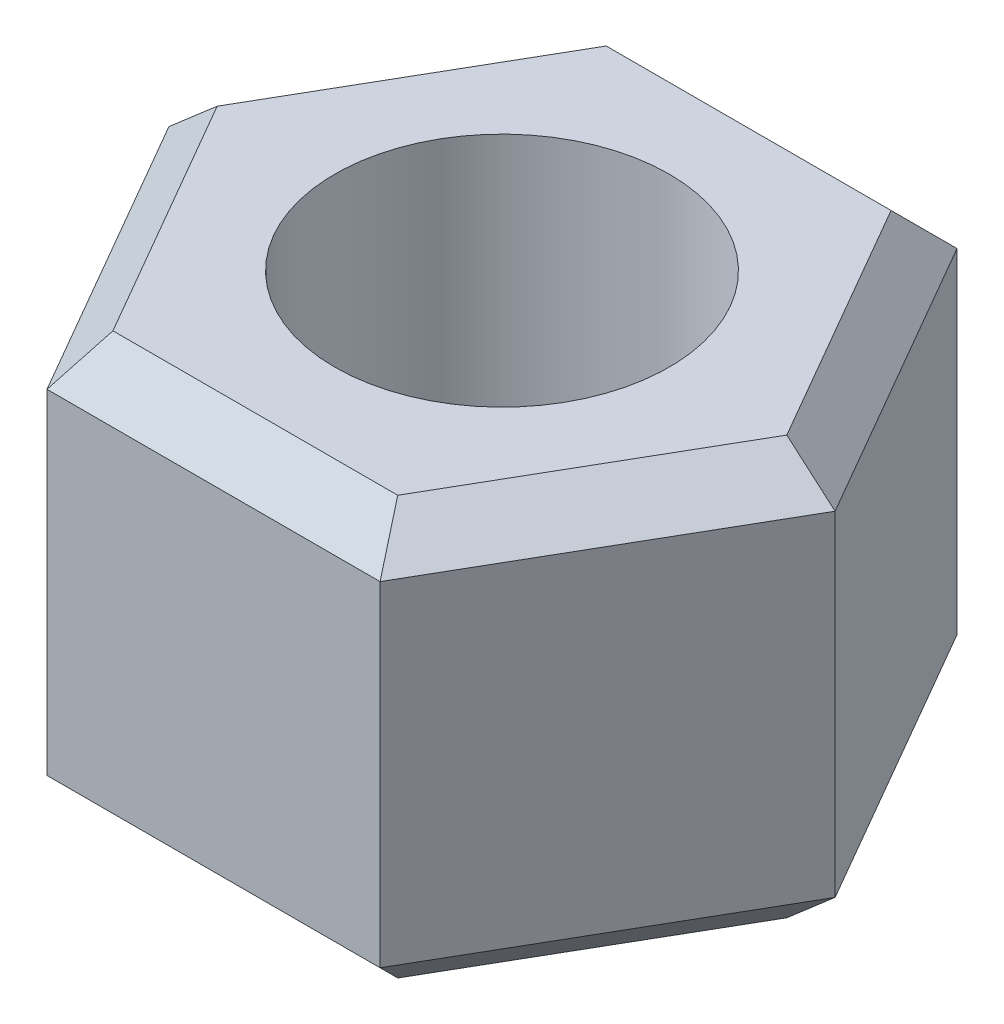
ISO-10303-21;
HEADER;
FILE_DESCRIPTION(('STEP AP214'),'2;1');
FILE_NAME('part.step','',(''),(''),'','','');
FILE_SCHEMA(('AUTOMOTIVE_DESIGN { 1 0 10303 214 1 1 1 1 }'));
ENDSEC;
DATA;
#1=APPLICATION_CONTEXT('core data for automotive mechanical design processes');
#2=APPLICATION_PROTOCOL_DEFINITION('international standard','automotive_design',2000,#1);
#3=PRODUCT_CONTEXT('',#1,'mechanical');
#4=PRODUCT('Part','Part','',(#3));
#5=PRODUCT_RELATED_PRODUCT_CATEGORY('part','',(#4));
#6=PRODUCT_DEFINITION_FORMATION('','',#4);
#7=PRODUCT_DEFINITION_CONTEXT('part definition',#1,'design');
#8=PRODUCT_DEFINITION('design','',#6,#7);
#9=PRODUCT_DEFINITION_SHAPE('','',#8);
#10=(LENGTH_UNIT() NAMED_UNIT(*) SI_UNIT(.MILLI.,.METRE.));
#11=(NAMED_UNIT(*) PLANE_ANGLE_UNIT() SI_UNIT($,.RADIAN.));
#12=(NAMED_UNIT(*) SI_UNIT($,.STERADIAN.) SOLID_ANGLE_UNIT());
#13=UNCERTAINTY_MEASURE_WITH_UNIT(LENGTH_MEASURE(1.E-05),#10,'distance_accuracy_value','');
#14=(GEOMETRIC_REPRESENTATION_CONTEXT(3) GLOBAL_UNCERTAINTY_ASSIGNED_CONTEXT((#13)) GLOBAL_UNIT_ASSIGNED_CONTEXT((#10,
#11,#12)) REPRESENTATION_CONTEXT('',''));
#15=CARTESIAN_POINT('',(0.,0.,0.));
#16=DIRECTION('',(0.,0.,1.));
#17=DIRECTION('',(1.,0.,0.));
#18=AXIS2_PLACEMENT_3D('',#15,#16,#17);
#19=CARTESIAN_POINT('',(0.,5.,0.));
#20=DIRECTION('',(0.,1.,0.));
#21=DIRECTION('',(0.,0.,1.));
#22=AXIS2_PLACEMENT_3D('',#19,#20,#21);
#23=PLANE('',#22);
#24=DIRECTION('',(-0.5,0.,-0.866025403784439));
#25=VECTOR('',#24,1.);
#26=CARTESIAN_POINT('',(1.55884572681199,5.,-3.2));
#27=LINE('',#26,#25);
#28=CARTESIAN_POINT('',(3.40636658821879,5.,0.));
#29=VERTEX_POINT('',#28);
#30=CARTESIAN_POINT('',(1.70318329410939,5.,-2.95));
#31=VERTEX_POINT('',#30);
#32=EDGE_CURVE('E47',#29,#31,#27,.T.);
#33=ORIENTED_EDGE('',*,*,#32,.T.);
#34=DIRECTION('',(-1.,0.,0.));
#35=VECTOR('',#34,1.);
#36=CARTESIAN_POINT('',(-1.99185842870421,5.,-2.95));
#37=LINE('',#36,#35);
#38=CARTESIAN_POINT('',(-1.7031832941094,5.,-2.95));
#39=VERTEX_POINT('',#38);
#40=EDGE_CURVE('E11',#31,#39,#37,.T.);
#41=ORIENTED_EDGE('',*,*,#40,.T.);
#42=DIRECTION('',(-0.5,0.,0.866025403784439));
#43=VECTOR('',#42,1.);
#44=CARTESIAN_POINT('',(-3.5507041555162,5.,0.250000000000001));
#45=LINE('',#44,#43);
#46=CARTESIAN_POINT('',(-3.40636658821879,5.,0.));
#47=VERTEX_POINT('',#46);
#48=EDGE_CURVE('E198',#39,#47,#45,.T.);
#49=ORIENTED_EDGE('',*,*,#48,.T.);
#50=DIRECTION('',(0.5,0.,0.866025403784439));
#51=VECTOR('',#50,1.);
#52=CARTESIAN_POINT('',(-1.55884572681199,5.,3.2));
#53=LINE('',#52,#51);
#54=CARTESIAN_POINT('',(-1.7031832941094,5.,2.95));
#55=VERTEX_POINT('',#54);
#56=EDGE_CURVE('E200',#47,#55,#53,.T.);
#57=ORIENTED_EDGE('',*,*,#56,.T.);
#58=DIRECTION('',(1.,0.,0.));
#59=VECTOR('',#58,1.);
#60=CARTESIAN_POINT('',(1.99185842870421,5.,2.95));
#61=LINE('',#60,#59);
#62=CARTESIAN_POINT('',(1.70318329410939,5.,2.95));
#63=VERTEX_POINT('',#62);
#64=EDGE_CURVE('E155',#55,#63,#61,.T.);
#65=ORIENTED_EDGE('',*,*,#64,.T.);
#66=DIRECTION('',(0.5,0.,-0.866025403784439));
#67=VECTOR('',#66,1.);
#68=CARTESIAN_POINT('',(3.5507041555162,5.,-0.25));
#69=LINE('',#68,#67);
#70=EDGE_CURVE('E58',#63,#29,#69,.T.);
#71=ORIENTED_EDGE('',*,*,#70,.T.);
#72=EDGE_LOOP('',(#33,#41,#49,#57,#65,#71));
#73=FACE_BOUND('',#72,.T.);
#74=CARTESIAN_POINT('',(0.,5.,0.));
#75=DIRECTION('',(0.,1.,0.));
#76=DIRECTION('',(0.,0.,1.));
#77=AXIS2_PLACEMENT_3D('',#74,#75,#76);
#78=CIRCLE('',#77,2.);
#79=CARTESIAN_POINT('',(0.,5.,2.));
#80=VERTEX_POINT('',#79);
#81=EDGE_CURVE('E251',#80,#80,#78,.T.);
#82=ORIENTED_EDGE('',*,*,#81,.F.);
#83=EDGE_LOOP('',(#82));
#84=FACE_BOUND('',#83,.T.);
#85=ADVANCED_FACE('F37',(#73,#84),#23,.T.);
#86=CARTESIAN_POINT('',(0.,0.,0.));
#87=DIRECTION('',(0.,1.,0.));
#88=DIRECTION('',(0.,0.,1.));
#89=AXIS2_PLACEMENT_3D('',#86,#87,#88);
#90=PLANE('',#89);
#91=DIRECTION('',(-1.,0.,0.));
#92=VECTOR('',#91,1.);
#93=CARTESIAN_POINT('',(0.,0.,2.95));
#94=LINE('',#93,#92);
#95=CARTESIAN_POINT('',(1.70318329410939,0.,2.95));
#96=VERTEX_POINT('',#95);
#97=CARTESIAN_POINT('',(-1.7031832941094,0.,2.95));
#98=VERTEX_POINT('',#97);
#99=EDGE_CURVE('E176',#96,#98,#94,.T.);
#100=ORIENTED_EDGE('',*,*,#99,.T.);
#101=DIRECTION('',(-0.5,0.,-0.866025403784439));
#102=VECTOR('',#101,1.);
#103=CARTESIAN_POINT('',(-2.5547749411641,0.,1.475));
#104=LINE('',#103,#102);
#105=CARTESIAN_POINT('',(-3.40636658821879,0.,0.));
#106=VERTEX_POINT('',#105);
#107=EDGE_CURVE('E139',#98,#106,#104,.T.);
#108=ORIENTED_EDGE('',*,*,#107,.T.);
#109=DIRECTION('',(0.5,0.,-0.866025403784439));
#110=VECTOR('',#109,1.);
#111=CARTESIAN_POINT('',(-2.5547749411641,0.,-1.475));
#112=LINE('',#111,#110);
#113=CARTESIAN_POINT('',(-1.7031832941094,0.,-2.95));
#114=VERTEX_POINT('',#113);
#115=EDGE_CURVE('E165',#106,#114,#112,.T.);
#116=ORIENTED_EDGE('',*,*,#115,.T.);
#117=DIRECTION('',(1.,0.,0.));
#118=VECTOR('',#117,1.);
#119=CARTESIAN_POINT('',(0.,0.,-2.95));
#120=LINE('',#119,#118);
#121=CARTESIAN_POINT('',(1.70318329410939,0.,-2.95));
#122=VERTEX_POINT('',#121);
#123=EDGE_CURVE('E170',#114,#122,#120,.T.);
#124=ORIENTED_EDGE('',*,*,#123,.T.);
#125=DIRECTION('',(0.5,0.,0.866025403784439));
#126=VECTOR('',#125,1.);
#127=CARTESIAN_POINT('',(2.55477494116409,0.,-1.475));
#128=LINE('',#127,#126);
#129=CARTESIAN_POINT('',(3.40636658821879,0.,0.));
#130=VERTEX_POINT('',#129);
#131=EDGE_CURVE('E172',#122,#130,#128,.T.);
#132=ORIENTED_EDGE('',*,*,#131,.T.);
#133=DIRECTION('',(-0.5,0.,0.866025403784439));
#134=VECTOR('',#133,1.);
#135=CARTESIAN_POINT('',(2.55477494116409,0.,1.475));
#136=LINE('',#135,#134);
#137=EDGE_CURVE('E174',#130,#96,#136,.T.);
#138=ORIENTED_EDGE('',*,*,#137,.T.);
#139=EDGE_LOOP('',(#100,#108,#116,#124,#132,#138));
#140=FACE_BOUND('',#139,.T.);
#141=CARTESIAN_POINT('',(0.,0.,0.));
#142=DIRECTION('',(0.,1.,0.));
#143=DIRECTION('',(0.,0.,1.));
#144=AXIS2_PLACEMENT_3D('',#141,#142,#143);
#145=CIRCLE('',#144,2.);
#146=CARTESIAN_POINT('',(0.,0.,2.));
#147=VERTEX_POINT('',#146);
#148=EDGE_CURVE('E221',#147,#147,#145,.T.);
#149=ORIENTED_EDGE('',*,*,#148,.T.);
#150=EDGE_LOOP('',(#149));
#151=FACE_BOUND('',#150,.T.);
#152=ADVANCED_FACE('F261',(#140,#151),#90,.F.);
#153=CARTESIAN_POINT('',(-1.99185842870421,5.,-3.45));
#154=DIRECTION('',(0.866025403784439,0.,0.5));
#155=DIRECTION('',(0.5,0.,-0.866025403784439));
#156=AXIS2_PLACEMENT_3D('',#153,#154,#155);
#157=PLANE('',#156);
#158=DIRECTION('',(0.,-1.,0.));
#159=VECTOR('',#158,1.);
#160=CARTESIAN_POINT('',(-1.99185842870421,5.,-3.45));
#161=LINE('',#160,#159);
#162=CARTESIAN_POINT('',(-1.99185842870421,4.5,-3.45));
#163=VERTEX_POINT('',#162);
#164=CARTESIAN_POINT('',(-1.99185842870421,0.499999999999999,-3.45));
#165=VERTEX_POINT('',#164);
#166=EDGE_CURVE('E246',#163,#165,#161,.T.);
#167=ORIENTED_EDGE('',*,*,#166,.T.);
#168=DIRECTION('',(-0.5,0.,0.866025403784439));
#169=VECTOR('',#168,1.);
#170=CARTESIAN_POINT('',(-1.99185842870421,0.499999999999999,-3.45));
#171=LINE('',#170,#169);
#172=CARTESIAN_POINT('',(-3.98371685740842,0.499999999999999,0.));
#173=VERTEX_POINT('',#172);
#174=EDGE_CURVE('E196',#165,#173,#171,.T.);
#175=ORIENTED_EDGE('',*,*,#174,.T.);
#176=DIRECTION('',(0.,-1.,0.));
#177=VECTOR('',#176,1.);
#178=CARTESIAN_POINT('',(-3.98371685740842,5.,0.));
#179=LINE('',#178,#177);
#180=CARTESIAN_POINT('',(-3.98371685740842,4.5,0.));
#181=VERTEX_POINT('',#180);
#182=EDGE_CURVE('E150',#181,#173,#179,.T.);
#183=ORIENTED_EDGE('',*,*,#182,.F.);
#184=DIRECTION('',(0.5,0.,-0.866025403784439));
#185=VECTOR('',#184,1.);
#186=CARTESIAN_POINT('',(-1.99185842870421,4.5,-3.45));
#187=LINE('',#186,#185);
#188=EDGE_CURVE('E194',#181,#163,#187,.T.);
#189=ORIENTED_EDGE('',*,*,#188,.T.);
#190=EDGE_LOOP('',(#167,#175,#183,#189));
#191=FACE_BOUND('',#190,.T.);
#192=ADVANCED_FACE('F266',(#191),#157,.F.);
#193=CARTESIAN_POINT('',(-3.98371685740842,5.,0.));
#194=DIRECTION('',(0.866025403784439,0.,-0.5));
#195=DIRECTION('',(-0.5,0.,-0.866025403784439));
#196=AXIS2_PLACEMENT_3D('',#193,#194,#195);
#197=PLANE('',#196);
#198=ORIENTED_EDGE('',*,*,#182,.T.);
#199=DIRECTION('',(0.5,0.,0.866025403784439));
#200=VECTOR('',#199,1.);
#201=CARTESIAN_POINT('',(-3.98371685740842,0.499999999999999,0.));
#202=LINE('',#201,#200);
#203=CARTESIAN_POINT('',(-1.99185842870421,0.499999999999999,3.45));
#204=VERTEX_POINT('',#203);
#205=EDGE_CURVE('E149',#173,#204,#202,.T.);
#206=ORIENTED_EDGE('',*,*,#205,.T.);
#207=DIRECTION('',(0.,-1.,0.));
#208=VECTOR('',#207,1.);
#209=CARTESIAN_POINT('',(-1.99185842870421,5.,3.45));
#210=LINE('',#209,#208);
#211=CARTESIAN_POINT('',(-1.99185842870421,4.5,3.45));
#212=VERTEX_POINT('',#211);
#213=EDGE_CURVE('E131',#212,#204,#210,.T.);
#214=ORIENTED_EDGE('',*,*,#213,.F.);
#215=DIRECTION('',(-0.5,0.,-0.866025403784439));
#216=VECTOR('',#215,1.);
#217=CARTESIAN_POINT('',(-3.98371685740842,4.5,0.));
#218=LINE('',#217,#216);
#219=EDGE_CURVE('E146',#212,#181,#218,.T.);
#220=ORIENTED_EDGE('',*,*,#219,.T.);
#221=EDGE_LOOP('',(#198,#206,#214,#220));
#222=FACE_BOUND('',#221,.T.);
#223=ADVANCED_FACE('F144',(#222),#197,.F.);
#224=CARTESIAN_POINT('',(-1.99185842870421,5.,3.45));
#225=DIRECTION('',(0.,0.,-1.));
#226=DIRECTION('',(-1.,0.,0.));
#227=AXIS2_PLACEMENT_3D('',#224,#225,#226);
#228=PLANE('',#227);
#229=ORIENTED_EDGE('',*,*,#213,.T.);
#230=DIRECTION('',(1.,0.,0.));
#231=VECTOR('',#230,1.);
#232=CARTESIAN_POINT('',(-1.99185842870421,0.499999999999999,3.45));
#233=LINE('',#232,#231);
#234=CARTESIAN_POINT('',(1.99185842870421,0.499999999999999,3.45));
#235=VERTEX_POINT('',#234);
#236=EDGE_CURVE('E138',#204,#235,#233,.T.);
#237=ORIENTED_EDGE('',*,*,#236,.T.);
#238=DIRECTION('',(0.,-1.,0.));
#239=VECTOR('',#238,1.);
#240=CARTESIAN_POINT('',(1.99185842870421,5.,3.45));
#241=LINE('',#240,#239);
#242=CARTESIAN_POINT('',(1.99185842870421,4.5,3.45));
#243=VERTEX_POINT('',#242);
#244=EDGE_CURVE('E133',#243,#235,#241,.T.);
#245=ORIENTED_EDGE('',*,*,#244,.F.);
#246=DIRECTION('',(-1.,0.,0.));
#247=VECTOR('',#246,1.);
#248=CARTESIAN_POINT('',(-1.99185842870421,4.5,3.45));
#249=LINE('',#248,#247);
#250=EDGE_CURVE('E128',#243,#212,#249,.T.);
#251=ORIENTED_EDGE('',*,*,#250,.T.);
#252=EDGE_LOOP('',(#229,#237,#245,#251));
#253=FACE_BOUND('',#252,.T.);
#254=ADVANCED_FACE('F130',(#253),#228,.F.);
#255=CARTESIAN_POINT('',(1.99185842870421,5.,3.45));
#256=DIRECTION('',(-0.866025403784439,0.,-0.5));
#257=DIRECTION('',(-0.5,0.,0.866025403784439));
#258=AXIS2_PLACEMENT_3D('',#255,#256,#257);
#259=PLANE('',#258);
#260=ORIENTED_EDGE('',*,*,#244,.T.);
#261=DIRECTION('',(0.5,0.,-0.866025403784439));
#262=VECTOR('',#261,1.);
#263=CARTESIAN_POINT('',(1.99185842870421,0.499999999999999,3.45));
#264=LINE('',#263,#262);
#265=CARTESIAN_POINT('',(3.98371685740842,0.499999999999999,0.));
#266=VERTEX_POINT('',#265);
#267=EDGE_CURVE('E183',#235,#266,#264,.T.);
#268=ORIENTED_EDGE('',*,*,#267,.T.);
#269=DIRECTION('',(0.,-1.,0.));
#270=VECTOR('',#269,1.);
#271=CARTESIAN_POINT('',(3.98371685740842,5.,0.));
#272=LINE('',#271,#270);
#273=CARTESIAN_POINT('',(3.98371685740842,4.5,0.));
#274=VERTEX_POINT('',#273);
#275=EDGE_CURVE('E239',#274,#266,#272,.T.);
#276=ORIENTED_EDGE('',*,*,#275,.F.);
#277=DIRECTION('',(-0.5,0.,0.866025403784439));
#278=VECTOR('',#277,1.);
#279=CARTESIAN_POINT('',(1.99185842870421,4.5,3.45));
#280=LINE('',#279,#278);
#281=EDGE_CURVE('E181',#274,#243,#280,.T.);
#282=ORIENTED_EDGE('',*,*,#281,.T.);
#283=EDGE_LOOP('',(#260,#268,#276,#282));
#284=FACE_BOUND('',#283,.T.);
#285=ADVANCED_FACE('F236',(#284),#259,.F.);
#286=CARTESIAN_POINT('',(3.98371685740842,5.,0.));
#287=DIRECTION('',(-0.866025403784439,0.,0.5));
#288=DIRECTION('',(0.5,0.,0.866025403784439));
#289=AXIS2_PLACEMENT_3D('',#286,#287,#288);
#290=PLANE('',#289);
#291=ORIENTED_EDGE('',*,*,#275,.T.);
#292=DIRECTION('',(-0.5,0.,-0.866025403784439));
#293=VECTOR('',#292,1.);
#294=CARTESIAN_POINT('',(3.98371685740842,0.499999999999999,0.));
#295=LINE('',#294,#293);
#296=CARTESIAN_POINT('',(1.99185842870421,0.499999999999999,-3.45));
#297=VERTEX_POINT('',#296);
#298=EDGE_CURVE('E187',#266,#297,#295,.T.);
#299=ORIENTED_EDGE('',*,*,#298,.T.);
#300=DIRECTION('',(0.,-1.,0.));
#301=VECTOR('',#300,1.);
#302=CARTESIAN_POINT('',(1.99185842870421,5.,-3.45));
#303=LINE('',#302,#301);
#304=CARTESIAN_POINT('',(1.99185842870421,4.5,-3.45));
#305=VERTEX_POINT('',#304);
#306=EDGE_CURVE('E242',#305,#297,#303,.T.);
#307=ORIENTED_EDGE('',*,*,#306,.F.);
#308=DIRECTION('',(0.5,0.,0.866025403784439));
#309=VECTOR('',#308,1.);
#310=CARTESIAN_POINT('',(3.98371685740842,4.5,0.));
#311=LINE('',#310,#309);
#312=EDGE_CURVE('E185',#305,#274,#311,.T.);
#313=ORIENTED_EDGE('',*,*,#312,.T.);
#314=EDGE_LOOP('',(#291,#299,#307,#313));
#315=FACE_BOUND('',#314,.T.);
#316=ADVANCED_FACE('F274',(#315),#290,.F.);
#317=CARTESIAN_POINT('',(1.99185842870421,5.,-3.45));
#318=DIRECTION('',(0.,0.,1.));
#319=DIRECTION('',(1.,0.,0.));
#320=AXIS2_PLACEMENT_3D('',#317,#318,#319);
#321=PLANE('',#320);
#322=ORIENTED_EDGE('',*,*,#306,.T.);
#323=DIRECTION('',(-1.,0.,0.));
#324=VECTOR('',#323,1.);
#325=CARTESIAN_POINT('',(1.99185842870421,0.499999999999999,-3.45));
#326=LINE('',#325,#324);
#327=EDGE_CURVE('E192',#297,#165,#326,.T.);
#328=ORIENTED_EDGE('',*,*,#327,.T.);
#329=ORIENTED_EDGE('',*,*,#166,.F.);
#330=DIRECTION('',(1.,0.,0.));
#331=VECTOR('',#330,1.);
#332=CARTESIAN_POINT('',(1.99185842870421,4.5,-3.45));
#333=LINE('',#332,#331);
#334=EDGE_CURVE('E189',#163,#305,#333,.T.);
#335=ORIENTED_EDGE('',*,*,#334,.T.);
#336=EDGE_LOOP('',(#322,#328,#329,#335));
#337=FACE_BOUND('',#336,.T.);
#338=ADVANCED_FACE('F271',(#337),#321,.F.);
#339=CARTESIAN_POINT('',(0.,5.,0.));
#340=DIRECTION('',(0.,-1.,0.));
#341=DIRECTION('',(0.,0.,-1.));
#342=AXIS2_PLACEMENT_3D('',#339,#340,#341);
#343=CYLINDRICAL_SURFACE('',#342,2.);
#344=ORIENTED_EDGE('',*,*,#81,.T.);
#345=EDGE_LOOP('',(#344));
#346=FACE_BOUND('',#345,.T.);
#347=ORIENTED_EDGE('',*,*,#148,.F.);
#348=EDGE_LOOP('',(#347));
#349=FACE_BOUND('',#348,.T.);
#350=ADVANCED_FACE('F257',(#346,#349),#343,.F.);
#351=CARTESIAN_POINT('',(3.98371685740842,0.499999999999999,0.));
#352=DIRECTION('',(-0.612372435695794,0.707106781186549,0.353553390593273));
#353=DIRECTION('',(-0.5,0.,-0.866025403784439));
#354=AXIS2_PLACEMENT_3D('',#351,#352,#353);
#355=PLANE('',#354);
#356=DIRECTION('',(-0.755928946018455,-0.654653670707976,0.));
#357=VECTOR('',#356,1.);
#358=CARTESIAN_POINT('',(3.98371685740842,0.499999999999999,0.));
#359=LINE('',#358,#357);
#360=EDGE_CURVE('E215',#130,#266,#359,.F.);
#361=ORIENTED_EDGE('',*,*,#360,.F.);
#362=ORIENTED_EDGE('',*,*,#131,.F.);
#363=DIRECTION('',(-0.377964473009227,-0.654653670707976,0.654653670707978));
#364=VECTOR('',#363,1.);
#365=CARTESIAN_POINT('',(1.99185842870421,0.499999999999999,-3.45));
#366=LINE('',#365,#364);
#367=EDGE_CURVE('E218',#297,#122,#366,.T.);
#368=ORIENTED_EDGE('',*,*,#367,.F.);
#369=ORIENTED_EDGE('',*,*,#298,.F.);
#370=EDGE_LOOP('',(#361,#362,#368,#369));
#371=FACE_BOUND('',#370,.T.);
#372=ADVANCED_FACE('F322',(#371),#355,.F.);
#373=CARTESIAN_POINT('',(1.99185842870421,0.499999999999999,-3.45));
#374=DIRECTION('',(0.,0.707106781186549,0.707106781186546));
#375=DIRECTION('',(-1.,0.,0.));
#376=AXIS2_PLACEMENT_3D('',#373,#374,#375);
#377=PLANE('',#376);
#378=ORIENTED_EDGE('',*,*,#367,.T.);
#379=ORIENTED_EDGE('',*,*,#123,.F.);
#380=DIRECTION('',(0.377964473009228,-0.654653670707976,0.654653670707978));
#381=VECTOR('',#380,1.);
#382=CARTESIAN_POINT('',(-1.99185842870421,0.499999999999999,-3.45));
#383=LINE('',#382,#381);
#384=EDGE_CURVE('E212',#165,#114,#383,.T.);
#385=ORIENTED_EDGE('',*,*,#384,.F.);
#386=ORIENTED_EDGE('',*,*,#327,.F.);
#387=EDGE_LOOP('',(#378,#379,#385,#386));
#388=FACE_BOUND('',#387,.T.);
#389=ADVANCED_FACE('F315',(#388),#377,.F.);
#390=CARTESIAN_POINT('',(1.99185842870421,0.499999999999999,3.45));
#391=DIRECTION('',(-0.612372435695794,0.707106781186548,-0.353553390593273));
#392=DIRECTION('',(0.5,0.,-0.866025403784439));
#393=AXIS2_PLACEMENT_3D('',#390,#391,#392);
#394=PLANE('',#393);
#395=ORIENTED_EDGE('',*,*,#360,.T.);
#396=ORIENTED_EDGE('',*,*,#267,.F.);
#397=DIRECTION('',(-0.377964473009227,-0.654653670707976,-0.654653670707978));
#398=VECTOR('',#397,1.);
#399=CARTESIAN_POINT('',(1.99185842870421,0.499999999999999,3.45));
#400=LINE('',#399,#398);
#401=EDGE_CURVE('E209',#96,#235,#400,.F.);
#402=ORIENTED_EDGE('',*,*,#401,.F.);
#403=ORIENTED_EDGE('',*,*,#137,.F.);
#404=EDGE_LOOP('',(#395,#396,#402,#403));
#405=FACE_BOUND('',#404,.T.);
#406=ADVANCED_FACE('F308',(#405),#394,.F.);
#407=CARTESIAN_POINT('',(-1.99185842870421,0.499999999999999,-3.45));
#408=DIRECTION('',(0.612372435695793,0.707106781186549,0.353553390593273));
#409=DIRECTION('',(-0.5,0.,0.866025403784439));
#410=AXIS2_PLACEMENT_3D('',#407,#408,#409);
#411=PLANE('',#410);
#412=ORIENTED_EDGE('',*,*,#384,.T.);
#413=ORIENTED_EDGE('',*,*,#115,.F.);
#414=DIRECTION('',(-0.755928946018456,0.654653670707976,0.));
#415=VECTOR('',#414,1.);
#416=CARTESIAN_POINT('',(-2.84551204100601,-0.485714285714288,0.));
#417=LINE('',#416,#415);
#418=EDGE_CURVE('E207',#173,#106,#417,.F.);
#419=ORIENTED_EDGE('',*,*,#418,.F.);
#420=ORIENTED_EDGE('',*,*,#174,.F.);
#421=EDGE_LOOP('',(#412,#413,#419,#420));
#422=FACE_BOUND('',#421,.T.);
#423=ADVANCED_FACE('F301',(#422),#411,.F.);
#424=CARTESIAN_POINT('',(-1.99185842870421,0.499999999999999,3.45));
#425=DIRECTION('',(0.,0.707106781186549,-0.707106781186546));
#426=DIRECTION('',(1.,0.,0.));
#427=AXIS2_PLACEMENT_3D('',#424,#425,#426);
#428=PLANE('',#427);
#429=ORIENTED_EDGE('',*,*,#401,.T.);
#430=ORIENTED_EDGE('',*,*,#236,.F.);
#431=DIRECTION('',(0.377964473009228,-0.654653670707976,-0.654653670707978));
#432=VECTOR('',#431,1.);
#433=CARTESIAN_POINT('',(-1.99185842870421,0.499999999999999,3.45));
#434=LINE('',#433,#432);
#435=EDGE_CURVE('E205',#98,#204,#434,.F.);
#436=ORIENTED_EDGE('',*,*,#435,.F.);
#437=ORIENTED_EDGE('',*,*,#99,.F.);
#438=EDGE_LOOP('',(#429,#430,#436,#437));
#439=FACE_BOUND('',#438,.T.);
#440=ADVANCED_FACE('F294',(#439),#428,.F.);
#441=CARTESIAN_POINT('',(-3.98371685740842,0.499999999999999,0.));
#442=DIRECTION('',(0.612372435695793,0.707106781186549,-0.353553390593273));
#443=DIRECTION('',(0.5,0.,0.866025403784439));
#444=AXIS2_PLACEMENT_3D('',#441,#442,#443);
#445=PLANE('',#444);
#446=ORIENTED_EDGE('',*,*,#418,.T.);
#447=ORIENTED_EDGE('',*,*,#107,.F.);
#448=ORIENTED_EDGE('',*,*,#435,.T.);
#449=ORIENTED_EDGE('',*,*,#205,.F.);
#450=EDGE_LOOP('',(#446,#447,#448,#449));
#451=FACE_BOUND('',#450,.T.);
#452=ADVANCED_FACE('F288',(#451),#445,.F.);
#453=CARTESIAN_POINT('',(0.,5.,2.95));
#454=DIRECTION('',(0.,0.707106781186547,0.707106781186548));
#455=DIRECTION('',(-1.,0.,0.));
#456=AXIS2_PLACEMENT_3D('',#453,#454,#455);
#457=PLANE('',#456);
#458=DIRECTION('',(0.377964473009227,0.654653670707978,-0.654653670707977));
#459=VECTOR('',#458,1.);
#460=CARTESIAN_POINT('',(-1.45987139495091,5.42142857142857,2.52857142857143));
#461=LINE('',#460,#459);
#462=EDGE_CURVE('E154',#212,#55,#461,.T.);
#463=ORIENTED_EDGE('',*,*,#462,.F.);
#464=ORIENTED_EDGE('',*,*,#250,.F.);
#465=DIRECTION('',(-0.377964473009227,0.654653670707978,-0.654653670707977));
#466=VECTOR('',#465,1.);
#467=CARTESIAN_POINT('',(1.45987139495091,5.42142857142857,2.52857142857143));
#468=LINE('',#467,#466);
#469=EDGE_CURVE('E42',#63,#243,#468,.F.);
#470=ORIENTED_EDGE('',*,*,#469,.F.);
#471=ORIENTED_EDGE('',*,*,#64,.F.);
#472=EDGE_LOOP('',(#463,#464,#470,#471));
#473=FACE_BOUND('',#472,.T.);
#474=ADVANCED_FACE('F40',(#473),#457,.T.);
#475=CARTESIAN_POINT('',(2.55477494116409,5.,1.475));
#476=DIRECTION('',(0.612372435695795,0.707106781186547,0.353553390593274));
#477=DIRECTION('',(-0.5,0.,0.866025403784439));
#478=AXIS2_PLACEMENT_3D('',#475,#476,#477);
#479=PLANE('',#478);
#480=ORIENTED_EDGE('',*,*,#469,.T.);
#481=ORIENTED_EDGE('',*,*,#281,.F.);
#482=DIRECTION('',(-0.755928946018454,0.654653670707978,0.));
#483=VECTOR('',#482,1.);
#484=CARTESIAN_POINT('',(2.91974278990182,5.42142857142857,0.));
#485=LINE('',#484,#483);
#486=EDGE_CURVE('E158',#29,#274,#485,.F.);
#487=ORIENTED_EDGE('',*,*,#486,.F.);
#488=ORIENTED_EDGE('',*,*,#70,.F.);
#489=EDGE_LOOP('',(#480,#481,#487,#488));
#490=FACE_BOUND('',#489,.T.);
#491=ADVANCED_FACE('F233',(#490),#479,.T.);
#492=CARTESIAN_POINT('',(-2.5547749411641,5.,1.475));
#493=DIRECTION('',(-0.612372435695795,0.707106781186547,0.353553390593274));
#494=DIRECTION('',(-0.5,0.,-0.866025403784439));
#495=AXIS2_PLACEMENT_3D('',#492,#493,#494);
#496=PLANE('',#495);
#497=ORIENTED_EDGE('',*,*,#462,.T.);
#498=ORIENTED_EDGE('',*,*,#56,.F.);
#499=DIRECTION('',(0.755928946018454,0.654653670707978,0.));
#500=VECTOR('',#499,1.);
#501=CARTESIAN_POINT('',(-2.91974278990183,5.42142857142857,0.));
#502=LINE('',#501,#500);
#503=EDGE_CURVE('E162',#181,#47,#502,.T.);
#504=ORIENTED_EDGE('',*,*,#503,.F.);
#505=ORIENTED_EDGE('',*,*,#219,.F.);
#506=EDGE_LOOP('',(#497,#498,#504,#505));
#507=FACE_BOUND('',#506,.T.);
#508=ADVANCED_FACE('F160',(#507),#496,.T.);
#509=CARTESIAN_POINT('',(2.55477494116409,5.,-1.475));
#510=DIRECTION('',(0.612372435695795,0.707106781186547,-0.353553390593274));
#511=DIRECTION('',(0.5,0.,0.866025403784439));
#512=AXIS2_PLACEMENT_3D('',#509,#510,#511);
#513=PLANE('',#512);
#514=ORIENTED_EDGE('',*,*,#486,.T.);
#515=ORIENTED_EDGE('',*,*,#312,.F.);
#516=DIRECTION('',(-0.377964473009227,0.654653670707978,0.654653670707977));
#517=VECTOR('',#516,1.);
#518=CARTESIAN_POINT('',(1.45987139495091,5.42142857142857,-2.52857142857143));
#519=LINE('',#518,#517);
#520=EDGE_CURVE('E224',#31,#305,#519,.F.);
#521=ORIENTED_EDGE('',*,*,#520,.F.);
#522=ORIENTED_EDGE('',*,*,#32,.F.);
#523=EDGE_LOOP('',(#514,#515,#521,#522));
#524=FACE_BOUND('',#523,.T.);
#525=ADVANCED_FACE('F230',(#524),#513,.T.);
#526=CARTESIAN_POINT('',(-2.5547749411641,5.,-1.475));
#527=DIRECTION('',(-0.612372435695795,0.707106781186547,-0.353553390593274));
#528=DIRECTION('',(0.5,0.,-0.866025403784439));
#529=AXIS2_PLACEMENT_3D('',#526,#527,#528);
#530=PLANE('',#529);
#531=ORIENTED_EDGE('',*,*,#503,.T.);
#532=ORIENTED_EDGE('',*,*,#48,.F.);
#533=DIRECTION('',(-0.377964473009227,-0.654653670707978,-0.654653670707977));
#534=VECTOR('',#533,1.);
#535=CARTESIAN_POINT('',(-1.45987139495091,5.42142857142857,-2.52857142857143));
#536=LINE('',#535,#534);
#537=EDGE_CURVE('E222',#163,#39,#536,.F.);
#538=ORIENTED_EDGE('',*,*,#537,.F.);
#539=ORIENTED_EDGE('',*,*,#188,.F.);
#540=EDGE_LOOP('',(#531,#532,#538,#539));
#541=FACE_BOUND('',#540,.T.);
#542=ADVANCED_FACE('F336',(#541),#530,.T.);
#543=CARTESIAN_POINT('',(0.,5.,-2.95));
#544=DIRECTION('',(0.,0.707106781186547,-0.707106781186548));
#545=DIRECTION('',(1.,0.,0.));
#546=AXIS2_PLACEMENT_3D('',#543,#544,#545);
#547=PLANE('',#546);
#548=ORIENTED_EDGE('',*,*,#520,.T.);
#549=ORIENTED_EDGE('',*,*,#334,.F.);
#550=ORIENTED_EDGE('',*,*,#537,.T.);
#551=ORIENTED_EDGE('',*,*,#40,.F.);
#552=EDGE_LOOP('',(#548,#549,#550,#551));
#553=FACE_BOUND('',#552,.T.);
#554=ADVANCED_FACE('F330',(#553),#547,.T.);
#555=CLOSED_SHELL('',(#85,#152,#192,#223,#254,#285,#316,#338,#350,#372,#389,#406,#423,#440,#452,
#474,#491,#508,#525,#542,#554));
#556=MANIFOLD_SOLID_BREP('B2',#555);
#557=ADVANCED_BREP_SHAPE_REPRESENTATION('',(#18,#556),#14);
#558=SHAPE_DEFINITION_REPRESENTATION(#9,#557);
ENDSEC;
END-ISO-10303-21;
